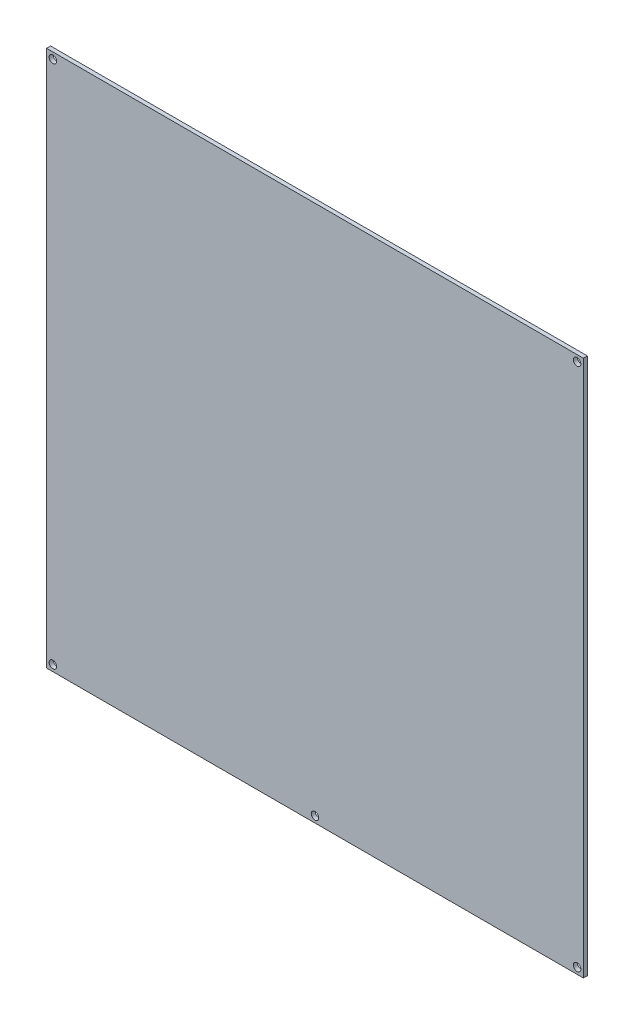
ISO-10303-21;
HEADER;
FILE_DESCRIPTION(('STEP AP214'),'2;1');
FILE_NAME('part.step','',(''),(''),'','','');
FILE_SCHEMA(('AUTOMOTIVE_DESIGN { 1 0 10303 214 1 1 1 1 }'));
ENDSEC;
DATA;
#1=APPLICATION_CONTEXT('core data for automotive mechanical design processes');
#2=APPLICATION_PROTOCOL_DEFINITION('international standard','automotive_design',2000,#1);
#3=PRODUCT_CONTEXT('',#1,'mechanical');
#4=PRODUCT('Part','Part','',(#3));
#5=PRODUCT_RELATED_PRODUCT_CATEGORY('part','',(#4));
#6=PRODUCT_DEFINITION_FORMATION('','',#4);
#7=PRODUCT_DEFINITION_CONTEXT('part definition',#1,'design');
#8=PRODUCT_DEFINITION('design','',#6,#7);
#9=PRODUCT_DEFINITION_SHAPE('','',#8);
#10=(LENGTH_UNIT() NAMED_UNIT(*) SI_UNIT(.MILLI.,.METRE.));
#11=(NAMED_UNIT(*) PLANE_ANGLE_UNIT() SI_UNIT($,.RADIAN.));
#12=(NAMED_UNIT(*) SI_UNIT($,.STERADIAN.) SOLID_ANGLE_UNIT());
#13=UNCERTAINTY_MEASURE_WITH_UNIT(LENGTH_MEASURE(1.E-05),#10,'distance_accuracy_value','');
#14=(GEOMETRIC_REPRESENTATION_CONTEXT(3) GLOBAL_UNCERTAINTY_ASSIGNED_CONTEXT((#13)) GLOBAL_UNIT_ASSIGNED_CONTEXT((#10,
#11,#12)) REPRESENTATION_CONTEXT('',''));
#15=CARTESIAN_POINT('',(0.,0.,0.));
#16=DIRECTION('',(0.,0.,1.));
#17=DIRECTION('',(1.,0.,0.));
#18=AXIS2_PLACEMENT_3D('',#15,#16,#17);
#19=CARTESIAN_POINT('',(0.,0.,1.6));
#20=DIRECTION('',(0.,0.,-1.));
#21=DIRECTION('',(-1.,0.,0.));
#22=AXIS2_PLACEMENT_3D('',#19,#20,#21);
#23=PLANE('',#22);
#24=CARTESIAN_POINT('',(104.5,-104.5,1.6));
#25=DIRECTION('',(0.,0.,1.));
#26=DIRECTION('',(-1.,0.,0.));
#27=AXIS2_PLACEMENT_3D('',#24,#25,#26);
#28=CIRCLE('',#27,1.5);
#29=CARTESIAN_POINT('',(103.,-104.5,1.6));
#30=VERTEX_POINT('',#29);
#31=EDGE_CURVE('E128',#30,#30,#28,.T.);
#32=ORIENTED_EDGE('',*,*,#31,.F.);
#33=EDGE_LOOP('',(#32));
#34=FACE_BOUND('',#33,.T.);
#35=CARTESIAN_POINT('',(104.5,104.5,1.6));
#36=DIRECTION('',(0.,0.,1.));
#37=DIRECTION('',(1.,0.,0.));
#38=AXIS2_PLACEMENT_3D('',#35,#36,#37);
#39=CIRCLE('',#38,1.5);
#40=CARTESIAN_POINT('',(106.,104.5,1.6));
#41=VERTEX_POINT('',#40);
#42=EDGE_CURVE('E116',#41,#41,#39,.T.);
#43=ORIENTED_EDGE('',*,*,#42,.F.);
#44=EDGE_LOOP('',(#43));
#45=FACE_BOUND('',#44,.T.);
#46=DIRECTION('',(0.,1.,0.));
#47=VECTOR('',#46,1.);
#48=CARTESIAN_POINT('',(107.,-107.,1.6));
#49=LINE('',#48,#47);
#50=CARTESIAN_POINT('',(107.,-107.,1.6));
#51=VERTEX_POINT('',#50);
#52=CARTESIAN_POINT('',(107.,107.,1.6));
#53=VERTEX_POINT('',#52);
#54=EDGE_CURVE('E86',#51,#53,#49,.T.);
#55=ORIENTED_EDGE('',*,*,#54,.T.);
#56=DIRECTION('',(-1.,0.,0.));
#57=VECTOR('',#56,1.);
#58=CARTESIAN_POINT('',(-107.,107.,1.6));
#59=LINE('',#58,#57);
#60=CARTESIAN_POINT('',(-107.,107.,1.6));
#61=VERTEX_POINT('',#60);
#62=EDGE_CURVE('E81',#53,#61,#59,.T.);
#63=ORIENTED_EDGE('',*,*,#62,.T.);
#64=DIRECTION('',(0.,-1.,0.));
#65=VECTOR('',#64,1.);
#66=CARTESIAN_POINT('',(-107.,-107.,1.6));
#67=LINE('',#66,#65);
#68=CARTESIAN_POINT('',(-107.,-107.,1.6));
#69=VERTEX_POINT('',#68);
#70=EDGE_CURVE('E84',#61,#69,#67,.T.);
#71=ORIENTED_EDGE('',*,*,#70,.T.);
#72=DIRECTION('',(1.,0.,0.));
#73=VECTOR('',#72,1.);
#74=CARTESIAN_POINT('',(-107.,-107.,1.6));
#75=LINE('',#74,#73);
#76=EDGE_CURVE('E51',#69,#51,#75,.T.);
#77=ORIENTED_EDGE('',*,*,#76,.T.);
#78=EDGE_LOOP('',(#55,#63,#71,#77));
#79=FACE_BOUND('',#78,.T.);
#80=CARTESIAN_POINT('',(-104.5,104.5,1.6));
#81=DIRECTION('',(0.,0.,1.));
#82=DIRECTION('',(1.,0.,0.));
#83=AXIS2_PLACEMENT_3D('',#80,#81,#82);
#84=CIRCLE('',#83,1.5);
#85=CARTESIAN_POINT('',(-103.,104.5,1.6));
#86=VERTEX_POINT('',#85);
#87=EDGE_CURVE('E101',#86,#86,#84,.T.);
#88=ORIENTED_EDGE('',*,*,#87,.F.);
#89=EDGE_LOOP('',(#88));
#90=FACE_BOUND('',#89,.T.);
#91=CARTESIAN_POINT('',(0.,-104.5,1.6));
#92=DIRECTION('',(0.,0.,1.));
#93=DIRECTION('',(1.,0.,0.));
#94=AXIS2_PLACEMENT_3D('',#91,#92,#93);
#95=CIRCLE('',#94,1.5);
#96=CARTESIAN_POINT('',(1.5,-104.5,1.6));
#97=VERTEX_POINT('',#96);
#98=EDGE_CURVE('E122',#97,#97,#95,.T.);
#99=ORIENTED_EDGE('',*,*,#98,.F.);
#100=EDGE_LOOP('',(#99));
#101=FACE_BOUND('',#100,.T.);
#102=CARTESIAN_POINT('',(-104.5,-104.5,1.6));
#103=DIRECTION('',(0.,0.,1.));
#104=DIRECTION('',(-1.,0.,0.));
#105=AXIS2_PLACEMENT_3D('',#102,#103,#104);
#106=CIRCLE('',#105,1.5);
#107=CARTESIAN_POINT('',(-106.,-104.5,1.6));
#108=VERTEX_POINT('',#107);
#109=EDGE_CURVE('E134',#108,#108,#106,.T.);
#110=ORIENTED_EDGE('',*,*,#109,.F.);
#111=EDGE_LOOP('',(#110));
#112=FACE_BOUND('',#111,.T.);
#113=ADVANCED_FACE('F34',(#34,#45,#79,#90,#101,#112),#23,.F.);
#114=CARTESIAN_POINT('',(0.,0.,0.));
#115=DIRECTION('',(0.,0.,-1.));
#116=DIRECTION('',(-1.,0.,0.));
#117=AXIS2_PLACEMENT_3D('',#114,#115,#116);
#118=PLANE('',#117);
#119=CARTESIAN_POINT('',(104.5,-104.5,0.));
#120=DIRECTION('',(0.,0.,1.));
#121=DIRECTION('',(-1.,0.,0.));
#122=AXIS2_PLACEMENT_3D('',#119,#120,#121);
#123=CIRCLE('',#122,1.5);
#124=CARTESIAN_POINT('',(103.,-104.5,0.));
#125=VERTEX_POINT('',#124);
#126=EDGE_CURVE('E131',#125,#125,#123,.T.);
#127=ORIENTED_EDGE('',*,*,#126,.T.);
#128=EDGE_LOOP('',(#127));
#129=FACE_BOUND('',#128,.T.);
#130=CARTESIAN_POINT('',(104.5,104.5,0.));
#131=DIRECTION('',(0.,0.,1.));
#132=DIRECTION('',(1.,0.,0.));
#133=AXIS2_PLACEMENT_3D('',#130,#131,#132);
#134=CIRCLE('',#133,1.5);
#135=CARTESIAN_POINT('',(106.,104.5,0.));
#136=VERTEX_POINT('',#135);
#137=EDGE_CURVE('E119',#136,#136,#134,.T.);
#138=ORIENTED_EDGE('',*,*,#137,.T.);
#139=EDGE_LOOP('',(#138));
#140=FACE_BOUND('',#139,.T.);
#141=DIRECTION('',(0.,1.,0.));
#142=VECTOR('',#141,1.);
#143=CARTESIAN_POINT('',(107.,-107.,0.));
#144=LINE('',#143,#142);
#145=CARTESIAN_POINT('',(107.,-107.,0.));
#146=VERTEX_POINT('',#145);
#147=CARTESIAN_POINT('',(107.,107.,0.));
#148=VERTEX_POINT('',#147);
#149=EDGE_CURVE('E98',#146,#148,#144,.T.);
#150=ORIENTED_EDGE('',*,*,#149,.F.);
#151=DIRECTION('',(1.,0.,0.));
#152=VECTOR('',#151,1.);
#153=CARTESIAN_POINT('',(-107.,-107.,0.));
#154=LINE('',#153,#152);
#155=CARTESIAN_POINT('',(-107.,-107.,0.));
#156=VERTEX_POINT('',#155);
#157=EDGE_CURVE('E74',#156,#146,#154,.T.);
#158=ORIENTED_EDGE('',*,*,#157,.F.);
#159=DIRECTION('',(0.,-1.,0.));
#160=VECTOR('',#159,1.);
#161=CARTESIAN_POINT('',(-107.,-107.,0.));
#162=LINE('',#161,#160);
#163=CARTESIAN_POINT('',(-107.,107.,0.));
#164=VERTEX_POINT('',#163);
#165=EDGE_CURVE('E68',#164,#156,#162,.T.);
#166=ORIENTED_EDGE('',*,*,#165,.F.);
#167=DIRECTION('',(-1.,0.,0.));
#168=VECTOR('',#167,1.);
#169=CARTESIAN_POINT('',(-107.,107.,0.));
#170=LINE('',#169,#168);
#171=EDGE_CURVE('E90',#148,#164,#170,.T.);
#172=ORIENTED_EDGE('',*,*,#171,.F.);
#173=EDGE_LOOP('',(#150,#158,#166,#172));
#174=FACE_BOUND('',#173,.T.);
#175=CARTESIAN_POINT('',(-104.5,104.5,0.));
#176=DIRECTION('',(0.,0.,1.));
#177=DIRECTION('',(1.,0.,0.));
#178=AXIS2_PLACEMENT_3D('',#175,#176,#177);
#179=CIRCLE('',#178,1.5);
#180=CARTESIAN_POINT('',(-103.,104.5,0.));
#181=VERTEX_POINT('',#180);
#182=EDGE_CURVE('E113',#181,#181,#179,.T.);
#183=ORIENTED_EDGE('',*,*,#182,.T.);
#184=EDGE_LOOP('',(#183));
#185=FACE_BOUND('',#184,.T.);
#186=CARTESIAN_POINT('',(0.,-104.5,0.));
#187=DIRECTION('',(0.,0.,1.));
#188=DIRECTION('',(1.,0.,0.));
#189=AXIS2_PLACEMENT_3D('',#186,#187,#188);
#190=CIRCLE('',#189,1.5);
#191=CARTESIAN_POINT('',(1.5,-104.5,0.));
#192=VERTEX_POINT('',#191);
#193=EDGE_CURVE('E125',#192,#192,#190,.T.);
#194=ORIENTED_EDGE('',*,*,#193,.T.);
#195=EDGE_LOOP('',(#194));
#196=FACE_BOUND('',#195,.T.);
#197=CARTESIAN_POINT('',(-104.5,-104.5,0.));
#198=DIRECTION('',(0.,0.,1.));
#199=DIRECTION('',(-1.,0.,0.));
#200=AXIS2_PLACEMENT_3D('',#197,#198,#199);
#201=CIRCLE('',#200,1.5);
#202=CARTESIAN_POINT('',(-106.,-104.5,0.));
#203=VERTEX_POINT('',#202);
#204=EDGE_CURVE('E137',#203,#203,#201,.T.);
#205=ORIENTED_EDGE('',*,*,#204,.T.);
#206=EDGE_LOOP('',(#205));
#207=FACE_BOUND('',#206,.T.);
#208=ADVANCED_FACE('F109',(#129,#140,#174,#185,#196,#207),#118,.T.);
#209=CARTESIAN_POINT('',(107.,-107.,1.6));
#210=DIRECTION('',(-1.,0.,0.));
#211=DIRECTION('',(0.,0.,1.));
#212=AXIS2_PLACEMENT_3D('',#209,#210,#211);
#213=PLANE('',#212);
#214=ORIENTED_EDGE('',*,*,#149,.T.);
#215=DIRECTION('',(0.,0.,-1.));
#216=VECTOR('',#215,1.);
#217=CARTESIAN_POINT('',(107.,107.,1.6));
#218=LINE('',#217,#216);
#219=EDGE_CURVE('E11',#53,#148,#218,.T.);
#220=ORIENTED_EDGE('',*,*,#219,.F.);
#221=ORIENTED_EDGE('',*,*,#54,.F.);
#222=DIRECTION('',(0.,0.,-1.));
#223=VECTOR('',#222,1.);
#224=CARTESIAN_POINT('',(107.,-107.,1.6));
#225=LINE('',#224,#223);
#226=EDGE_CURVE('E94',#51,#146,#225,.T.);
#227=ORIENTED_EDGE('',*,*,#226,.T.);
#228=EDGE_LOOP('',(#214,#220,#221,#227));
#229=FACE_BOUND('',#228,.T.);
#230=ADVANCED_FACE('F36',(#229),#213,.F.);
#231=CARTESIAN_POINT('',(-107.,107.,1.6));
#232=DIRECTION('',(0.,-1.,0.));
#233=DIRECTION('',(0.,0.,-1.));
#234=AXIS2_PLACEMENT_3D('',#231,#232,#233);
#235=PLANE('',#234);
#236=ORIENTED_EDGE('',*,*,#171,.T.);
#237=DIRECTION('',(0.,0.,-1.));
#238=VECTOR('',#237,1.);
#239=CARTESIAN_POINT('',(-107.,107.,1.6));
#240=LINE('',#239,#238);
#241=EDGE_CURVE('E43',#61,#164,#240,.T.);
#242=ORIENTED_EDGE('',*,*,#241,.F.);
#243=ORIENTED_EDGE('',*,*,#62,.F.);
#244=ORIENTED_EDGE('',*,*,#219,.T.);
#245=EDGE_LOOP('',(#236,#242,#243,#244));
#246=FACE_BOUND('',#245,.T.);
#247=ADVANCED_FACE('F89',(#246),#235,.F.);
#248=CARTESIAN_POINT('',(-107.,-107.,1.6));
#249=DIRECTION('',(1.,0.,0.));
#250=DIRECTION('',(0.,0.,-1.));
#251=AXIS2_PLACEMENT_3D('',#248,#249,#250);
#252=PLANE('',#251);
#253=ORIENTED_EDGE('',*,*,#165,.T.);
#254=DIRECTION('',(0.,0.,-1.));
#255=VECTOR('',#254,1.);
#256=CARTESIAN_POINT('',(-107.,-107.,1.6));
#257=LINE('',#256,#255);
#258=EDGE_CURVE('E91',#69,#156,#257,.T.);
#259=ORIENTED_EDGE('',*,*,#258,.F.);
#260=ORIENTED_EDGE('',*,*,#70,.F.);
#261=ORIENTED_EDGE('',*,*,#241,.T.);
#262=EDGE_LOOP('',(#253,#259,#260,#261));
#263=FACE_BOUND('',#262,.T.);
#264=ADVANCED_FACE('F92',(#263),#252,.F.);
#265=CARTESIAN_POINT('',(-107.,-107.,1.6));
#266=DIRECTION('',(0.,1.,0.));
#267=DIRECTION('',(0.,0.,1.));
#268=AXIS2_PLACEMENT_3D('',#265,#266,#267);
#269=PLANE('',#268);
#270=ORIENTED_EDGE('',*,*,#157,.T.);
#271=ORIENTED_EDGE('',*,*,#226,.F.);
#272=ORIENTED_EDGE('',*,*,#76,.F.);
#273=ORIENTED_EDGE('',*,*,#258,.T.);
#274=EDGE_LOOP('',(#270,#271,#272,#273));
#275=FACE_BOUND('',#274,.T.);
#276=ADVANCED_FACE('F106',(#275),#269,.F.);
#277=CARTESIAN_POINT('',(-104.5,104.5,1.6));
#278=DIRECTION('',(0.,0.,-1.));
#279=DIRECTION('',(-1.,0.,0.));
#280=AXIS2_PLACEMENT_3D('',#277,#278,#279);
#281=CYLINDRICAL_SURFACE('',#280,1.5);
#282=ORIENTED_EDGE('',*,*,#87,.T.);
#283=EDGE_LOOP('',(#282));
#284=FACE_BOUND('',#283,.T.);
#285=ORIENTED_EDGE('',*,*,#182,.F.);
#286=EDGE_LOOP('',(#285));
#287=FACE_BOUND('',#286,.T.);
#288=ADVANCED_FACE('F157',(#284,#287),#281,.F.);
#289=CARTESIAN_POINT('',(104.5,104.5,1.6));
#290=DIRECTION('',(0.,0.,-1.));
#291=DIRECTION('',(-1.,0.,0.));
#292=AXIS2_PLACEMENT_3D('',#289,#290,#291);
#293=CYLINDRICAL_SURFACE('',#292,1.5);
#294=ORIENTED_EDGE('',*,*,#42,.T.);
#295=EDGE_LOOP('',(#294));
#296=FACE_BOUND('',#295,.T.);
#297=ORIENTED_EDGE('',*,*,#137,.F.);
#298=EDGE_LOOP('',(#297));
#299=FACE_BOUND('',#298,.T.);
#300=ADVANCED_FACE('F203',(#296,#299),#293,.F.);
#301=CARTESIAN_POINT('',(0.,-104.5,1.6));
#302=DIRECTION('',(0.,0.,-1.));
#303=DIRECTION('',(-1.,0.,0.));
#304=AXIS2_PLACEMENT_3D('',#301,#302,#303);
#305=CYLINDRICAL_SURFACE('',#304,1.5);
#306=ORIENTED_EDGE('',*,*,#98,.T.);
#307=EDGE_LOOP('',(#306));
#308=FACE_BOUND('',#307,.T.);
#309=ORIENTED_EDGE('',*,*,#193,.F.);
#310=EDGE_LOOP('',(#309));
#311=FACE_BOUND('',#310,.T.);
#312=ADVANCED_FACE('F211',(#308,#311),#305,.F.);
#313=CARTESIAN_POINT('',(104.5,-104.5,1.6));
#314=DIRECTION('',(0.,0.,-1.));
#315=DIRECTION('',(-1.,0.,0.));
#316=AXIS2_PLACEMENT_3D('',#313,#314,#315);
#317=CYLINDRICAL_SURFACE('',#316,1.5);
#318=ORIENTED_EDGE('',*,*,#31,.T.);
#319=EDGE_LOOP('',(#318));
#320=FACE_BOUND('',#319,.T.);
#321=ORIENTED_EDGE('',*,*,#126,.F.);
#322=EDGE_LOOP('',(#321));
#323=FACE_BOUND('',#322,.T.);
#324=ADVANCED_FACE('F219',(#320,#323),#317,.F.);
#325=CARTESIAN_POINT('',(-104.5,-104.5,1.6));
#326=DIRECTION('',(0.,0.,-1.));
#327=DIRECTION('',(-1.,0.,0.));
#328=AXIS2_PLACEMENT_3D('',#325,#326,#327);
#329=CYLINDRICAL_SURFACE('',#328,1.5);
#330=ORIENTED_EDGE('',*,*,#109,.T.);
#331=EDGE_LOOP('',(#330));
#332=FACE_BOUND('',#331,.T.);
#333=ORIENTED_EDGE('',*,*,#204,.F.);
#334=EDGE_LOOP('',(#333));
#335=FACE_BOUND('',#334,.T.);
#336=ADVANCED_FACE('F143',(#332,#335),#329,.F.);
#337=CLOSED_SHELL('',(#113,#208,#230,#247,#264,#276,#288,#300,#312,#324,#336));
#338=MANIFOLD_SOLID_BREP('B2',#337);
#339=ADVANCED_BREP_SHAPE_REPRESENTATION('',(#18,#338),#14);
#340=SHAPE_DEFINITION_REPRESENTATION(#9,#339);
ENDSEC;
END-ISO-10303-21;
